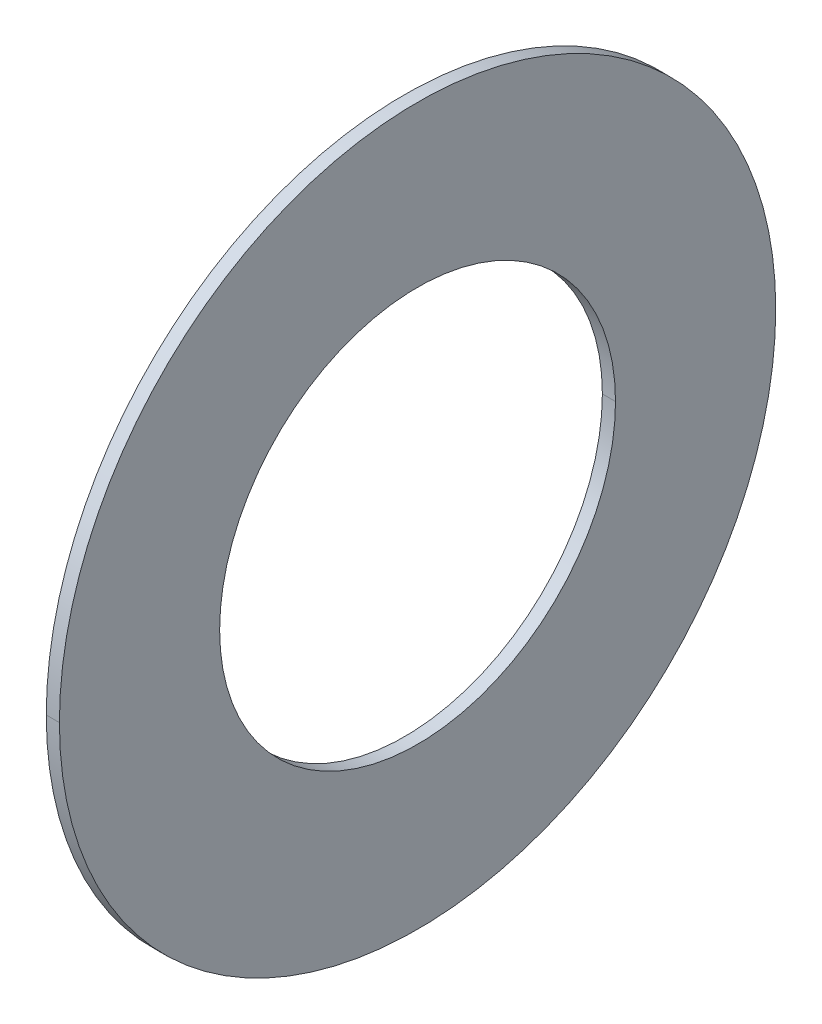
ISO-10303-21;
HEADER;
FILE_DESCRIPTION(('STEP AP214'),'2;1');
FILE_NAME('part.step','',(''),(''),'','','');
FILE_SCHEMA(('AUTOMOTIVE_DESIGN { 1 0 10303 214 1 1 1 1 }'));
ENDSEC;
DATA;
#1=APPLICATION_CONTEXT('core data for automotive mechanical design processes');
#2=APPLICATION_PROTOCOL_DEFINITION('international standard','automotive_design',2000,#1);
#3=PRODUCT_CONTEXT('',#1,'mechanical');
#4=PRODUCT('Part','Part','',(#3));
#5=PRODUCT_RELATED_PRODUCT_CATEGORY('part','',(#4));
#6=PRODUCT_DEFINITION_FORMATION('','',#4);
#7=PRODUCT_DEFINITION_CONTEXT('part definition',#1,'design');
#8=PRODUCT_DEFINITION('design','',#6,#7);
#9=PRODUCT_DEFINITION_SHAPE('','',#8);
#10=(LENGTH_UNIT() NAMED_UNIT(*) SI_UNIT(.MILLI.,.METRE.));
#11=(NAMED_UNIT(*) PLANE_ANGLE_UNIT() SI_UNIT($,.RADIAN.));
#12=(NAMED_UNIT(*) SI_UNIT($,.STERADIAN.) SOLID_ANGLE_UNIT());
#13=UNCERTAINTY_MEASURE_WITH_UNIT(LENGTH_MEASURE(1.E-05),#10,'distance_accuracy_value','');
#14=(GEOMETRIC_REPRESENTATION_CONTEXT(3) GLOBAL_UNCERTAINTY_ASSIGNED_CONTEXT((#13)) GLOBAL_UNIT_ASSIGNED_CONTEXT((#10,
#11,#12)) REPRESENTATION_CONTEXT('',''));
#15=CARTESIAN_POINT('',(0.,0.,0.));
#16=DIRECTION('',(0.,0.,1.));
#17=DIRECTION('',(1.,0.,0.));
#18=AXIS2_PLACEMENT_3D('',#15,#16,#17);
#19=CARTESIAN_POINT('',(0.4648,9.5,0.));
#20=DIRECTION('',(-1.,0.,0.));
#21=DIRECTION('',(0.,0.,1.));
#22=AXIS2_PLACEMENT_3D('',#19,#20,#21);
#23=PLANE('',#22);
#24=CARTESIAN_POINT('',(0.4648,0.,0.));
#25=DIRECTION('',(1.,0.,0.));
#26=DIRECTION('',(0.,0.,-1.));
#27=AXIS2_PLACEMENT_3D('',#24,#25,#26);
#28=CIRCLE('',#27,5.25);
#29=CARTESIAN_POINT('',(0.4648,0.,-5.25));
#30=VERTEX_POINT('',#29);
#31=CARTESIAN_POINT('',(0.4648,0.,5.25));
#32=VERTEX_POINT('',#31);
#33=EDGE_CURVE('E11',#30,#32,#28,.T.);
#34=ORIENTED_EDGE('',*,*,#33,.T.);
#35=CARTESIAN_POINT('',(0.4648,0.,0.));
#36=DIRECTION('',(1.,0.,0.));
#37=DIRECTION('',(0.,0.,-1.));
#38=AXIS2_PLACEMENT_3D('',#35,#36,#37);
#39=CIRCLE('',#38,5.25);
#40=EDGE_CURVE('E25',#32,#30,#39,.T.);
#41=ORIENTED_EDGE('',*,*,#40,.T.);
#42=EDGE_LOOP('',(#34,#41));
#43=FACE_BOUND('',#42,.T.);
#44=CARTESIAN_POINT('',(0.4648,0.,0.));
#45=DIRECTION('',(1.,0.,0.));
#46=DIRECTION('',(0.,0.,-1.));
#47=AXIS2_PLACEMENT_3D('',#44,#45,#46);
#48=CIRCLE('',#47,9.5);
#49=CARTESIAN_POINT('',(0.4648,0.,9.5));
#50=VERTEX_POINT('',#49);
#51=CARTESIAN_POINT('',(0.4648,0.,-9.5));
#52=VERTEX_POINT('',#51);
#53=EDGE_CURVE('E95',#50,#52,#48,.T.);
#54=ORIENTED_EDGE('',*,*,#53,.F.);
#55=CARTESIAN_POINT('',(0.4648,0.,0.));
#56=DIRECTION('',(1.,0.,0.));
#57=DIRECTION('',(0.,0.,-1.));
#58=AXIS2_PLACEMENT_3D('',#55,#56,#57);
#59=CIRCLE('',#58,9.5);
#60=EDGE_CURVE('E90',#52,#50,#59,.T.);
#61=ORIENTED_EDGE('',*,*,#60,.F.);
#62=EDGE_LOOP('',(#54,#61));
#63=FACE_BOUND('',#62,.T.);
#64=ADVANCED_FACE('F17',(#43,#63),#23,.T.);
#65=CARTESIAN_POINT('',(0.8134,0.,0.));
#66=DIRECTION('',(1.,0.,0.));
#67=DIRECTION('',(0.,-1.,0.));
#68=AXIS2_PLACEMENT_3D('',#65,#66,#67);
#69=CYLINDRICAL_SURFACE('',#68,9.5);
#70=DIRECTION('',(1.,0.,0.));
#71=VECTOR('',#70,1.);
#72=CARTESIAN_POINT('',(0.4648,0.,9.5));
#73=LINE('',#72,#71);
#74=CARTESIAN_POINT('',(0.8134,0.,9.5));
#75=VERTEX_POINT('',#74);
#76=EDGE_CURVE('E86',#50,#75,#73,.T.);
#77=ORIENTED_EDGE('',*,*,#76,.T.);
#78=CARTESIAN_POINT('',(0.8134,0.,0.));
#79=DIRECTION('',(1.,0.,0.));
#80=DIRECTION('',(0.,0.,-1.));
#81=AXIS2_PLACEMENT_3D('',#78,#79,#80);
#82=CIRCLE('',#81,9.5);
#83=CARTESIAN_POINT('',(0.8134,0.,-9.5));
#84=VERTEX_POINT('',#83);
#85=EDGE_CURVE('E81',#84,#75,#82,.T.);
#86=ORIENTED_EDGE('',*,*,#85,.F.);
#87=DIRECTION('',(1.,0.,0.));
#88=VECTOR('',#87,1.);
#89=CARTESIAN_POINT('',(0.4648,0.,-9.5));
#90=LINE('',#89,#88);
#91=EDGE_CURVE('E70',#52,#84,#90,.T.);
#92=ORIENTED_EDGE('',*,*,#91,.F.);
#93=ORIENTED_EDGE('',*,*,#60,.T.);
#94=EDGE_LOOP('',(#77,#86,#92,#93));
#95=FACE_BOUND('',#94,.T.);
#96=ADVANCED_FACE('F111',(#95),#69,.T.);
#97=CARTESIAN_POINT('',(0.8134,0.,0.));
#98=DIRECTION('',(1.,0.,0.));
#99=DIRECTION('',(0.,1.,0.));
#100=AXIS2_PLACEMENT_3D('',#97,#98,#99);
#101=CYLINDRICAL_SURFACE('',#100,9.5);
#102=ORIENTED_EDGE('',*,*,#76,.F.);
#103=ORIENTED_EDGE('',*,*,#53,.T.);
#104=ORIENTED_EDGE('',*,*,#91,.T.);
#105=CARTESIAN_POINT('',(0.8134,0.,0.));
#106=DIRECTION('',(1.,0.,0.));
#107=DIRECTION('',(0.,0.,-1.));
#108=AXIS2_PLACEMENT_3D('',#105,#106,#107);
#109=CIRCLE('',#108,9.5);
#110=EDGE_CURVE('E67',#75,#84,#109,.T.);
#111=ORIENTED_EDGE('',*,*,#110,.F.);
#112=EDGE_LOOP('',(#102,#103,#104,#111));
#113=FACE_BOUND('',#112,.T.);
#114=ADVANCED_FACE('F106',(#113),#101,.T.);
#115=CARTESIAN_POINT('',(0.8134,5.25,0.));
#116=DIRECTION('',(1.,0.,0.));
#117=DIRECTION('',(0.,0.,-1.));
#118=AXIS2_PLACEMENT_3D('',#115,#116,#117);
#119=PLANE('',#118);
#120=ORIENTED_EDGE('',*,*,#85,.T.);
#121=ORIENTED_EDGE('',*,*,#110,.T.);
#122=EDGE_LOOP('',(#120,#121));
#123=FACE_BOUND('',#122,.T.);
#124=CARTESIAN_POINT('',(0.8134,0.,0.));
#125=DIRECTION('',(1.,0.,0.));
#126=DIRECTION('',(0.,0.,-1.));
#127=AXIS2_PLACEMENT_3D('',#124,#125,#126);
#128=CIRCLE('',#127,5.25);
#129=CARTESIAN_POINT('',(0.8134,0.,5.25));
#130=VERTEX_POINT('',#129);
#131=CARTESIAN_POINT('',(0.8134,0.,-5.25));
#132=VERTEX_POINT('',#131);
#133=EDGE_CURVE('E55',#130,#132,#128,.T.);
#134=ORIENTED_EDGE('',*,*,#133,.F.);
#135=CARTESIAN_POINT('',(0.8134,0.,0.));
#136=DIRECTION('',(1.,0.,0.));
#137=DIRECTION('',(0.,0.,-1.));
#138=AXIS2_PLACEMENT_3D('',#135,#136,#137);
#139=CIRCLE('',#138,5.25);
#140=EDGE_CURVE('E51',#132,#130,#139,.T.);
#141=ORIENTED_EDGE('',*,*,#140,.F.);
#142=EDGE_LOOP('',(#134,#141));
#143=FACE_BOUND('',#142,.T.);
#144=ADVANCED_FACE('F53',(#123,#143),#119,.T.);
#145=CARTESIAN_POINT('',(0.8134,0.,0.));
#146=DIRECTION('',(1.,0.,0.));
#147=DIRECTION('',(0.,-1.,0.));
#148=AXIS2_PLACEMENT_3D('',#145,#146,#147);
#149=CYLINDRICAL_SURFACE('',#148,5.25);
#150=DIRECTION('',(1.,0.,0.));
#151=VECTOR('',#150,1.);
#152=CARTESIAN_POINT('',(0.4648,0.,5.25));
#153=LINE('',#152,#151);
#154=EDGE_CURVE('E59',#32,#130,#153,.T.);
#155=ORIENTED_EDGE('',*,*,#154,.F.);
#156=ORIENTED_EDGE('',*,*,#33,.F.);
#157=DIRECTION('',(1.,0.,0.));
#158=VECTOR('',#157,1.);
#159=CARTESIAN_POINT('',(0.4648,0.,-5.25));
#160=LINE('',#159,#158);
#161=EDGE_CURVE('E62',#30,#132,#160,.T.);
#162=ORIENTED_EDGE('',*,*,#161,.T.);
#163=ORIENTED_EDGE('',*,*,#140,.T.);
#164=EDGE_LOOP('',(#155,#156,#162,#163));
#165=FACE_BOUND('',#164,.T.);
#166=ADVANCED_FACE('F63',(#165),#149,.F.);
#167=CARTESIAN_POINT('',(0.8134,0.,0.));
#168=DIRECTION('',(1.,0.,0.));
#169=DIRECTION('',(0.,1.,0.));
#170=AXIS2_PLACEMENT_3D('',#167,#168,#169);
#171=CYLINDRICAL_SURFACE('',#170,5.25);
#172=ORIENTED_EDGE('',*,*,#154,.T.);
#173=ORIENTED_EDGE('',*,*,#133,.T.);
#174=ORIENTED_EDGE('',*,*,#161,.F.);
#175=ORIENTED_EDGE('',*,*,#40,.F.);
#176=EDGE_LOOP('',(#172,#173,#174,#175));
#177=FACE_BOUND('',#176,.T.);
#178=ADVANCED_FACE('F66',(#177),#171,.F.);
#179=CLOSED_SHELL('',(#64,#96,#114,#144,#166,#178));
#180=MANIFOLD_SOLID_BREP('B1',#179);
#181=ADVANCED_BREP_SHAPE_REPRESENTATION('',(#18,#180),#14);
#182=SHAPE_DEFINITION_REPRESENTATION(#9,#181);
ENDSEC;
END-ISO-10303-21;
